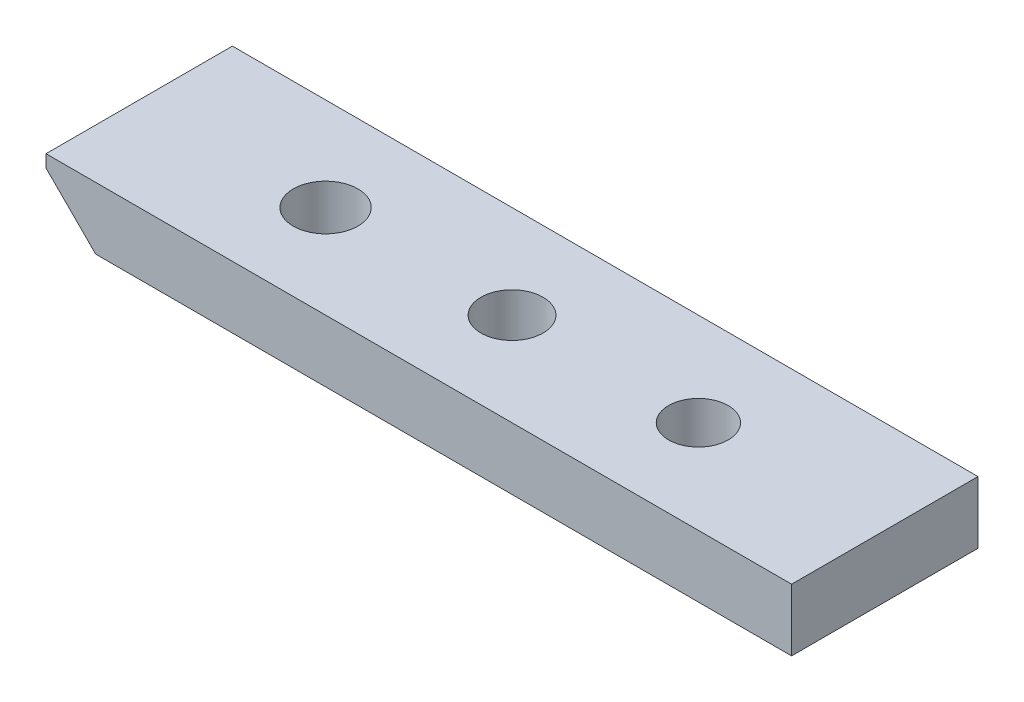
ISO-10303-21;
HEADER;
FILE_DESCRIPTION(('STEP AP214'),'2;1');
FILE_NAME('part.step','',(''),(''),'','','');
FILE_SCHEMA(('AUTOMOTIVE_DESIGN { 1 0 10303 214 1 1 1 1 }'));
ENDSEC;
DATA;
#1=APPLICATION_CONTEXT('core data for automotive mechanical design processes');
#2=APPLICATION_PROTOCOL_DEFINITION('international standard','automotive_design',2000,#1);
#3=PRODUCT_CONTEXT('',#1,'mechanical');
#4=PRODUCT('Part','Part','',(#3));
#5=PRODUCT_RELATED_PRODUCT_CATEGORY('part','',(#4));
#6=PRODUCT_DEFINITION_FORMATION('','',#4);
#7=PRODUCT_DEFINITION_CONTEXT('part definition',#1,'design');
#8=PRODUCT_DEFINITION('design','',#6,#7);
#9=PRODUCT_DEFINITION_SHAPE('','',#8);
#10=(LENGTH_UNIT() NAMED_UNIT(*) SI_UNIT(.MILLI.,.METRE.));
#11=(NAMED_UNIT(*) PLANE_ANGLE_UNIT() SI_UNIT($,.RADIAN.));
#12=(NAMED_UNIT(*) SI_UNIT($,.STERADIAN.) SOLID_ANGLE_UNIT());
#13=UNCERTAINTY_MEASURE_WITH_UNIT(LENGTH_MEASURE(1.E-05),#10,'distance_accuracy_value','');
#14=(GEOMETRIC_REPRESENTATION_CONTEXT(3) GLOBAL_UNCERTAINTY_ASSIGNED_CONTEXT((#13)) GLOBAL_UNIT_ASSIGNED_CONTEXT((#10,
#11,#12)) REPRESENTATION_CONTEXT('',''));
#15=CARTESIAN_POINT('',(0.,0.,0.));
#16=DIRECTION('',(0.,0.,1.));
#17=DIRECTION('',(1.,0.,0.));
#18=AXIS2_PLACEMENT_3D('',#15,#16,#17);
#19=CARTESIAN_POINT('',(-28.575,3.175,-4.7625));
#20=DIRECTION('',(1.,0.,0.));
#21=DIRECTION('',(0.,0.,-1.));
#22=AXIS2_PLACEMENT_3D('',#19,#20,#21);
#23=PLANE('',#22);
#24=DIRECTION('',(0.,-1.,0.));
#25=VECTOR('',#24,1.);
#26=CARTESIAN_POINT('',(-28.575,3.175,-4.7625));
#27=LINE('',#26,#25);
#28=CARTESIAN_POINT('',(-28.575,3.175,-4.7625));
#29=VERTEX_POINT('',#28);
#30=CARTESIAN_POINT('',(-28.575,2.54,-4.7625));
#31=VERTEX_POINT('',#30);
#32=EDGE_CURVE('E109',#29,#31,#27,.T.);
#33=ORIENTED_EDGE('',*,*,#32,.T.);
#34=DIRECTION('',(0.,0.,1.));
#35=VECTOR('',#34,1.);
#36=CARTESIAN_POINT('',(-28.575,2.54,-4.7625));
#37=LINE('',#36,#35);
#38=CARTESIAN_POINT('',(-28.575,2.54,4.7625));
#39=VERTEX_POINT('',#38);
#40=EDGE_CURVE('E100',#31,#39,#37,.T.);
#41=ORIENTED_EDGE('',*,*,#40,.T.);
#42=DIRECTION('',(0.,-1.,0.));
#43=VECTOR('',#42,1.);
#44=CARTESIAN_POINT('',(-28.575,3.175,4.7625));
#45=LINE('',#44,#43);
#46=CARTESIAN_POINT('',(-28.575,3.175,4.7625));
#47=VERTEX_POINT('',#46);
#48=EDGE_CURVE('E81',#47,#39,#45,.T.);
#49=ORIENTED_EDGE('',*,*,#48,.F.);
#50=DIRECTION('',(0.,0.,1.));
#51=VECTOR('',#50,1.);
#52=CARTESIAN_POINT('',(-28.575,3.175,-4.7625));
#53=LINE('',#52,#51);
#54=EDGE_CURVE('E87',#29,#47,#53,.T.);
#55=ORIENTED_EDGE('',*,*,#54,.F.);
#56=EDGE_LOOP('',(#33,#41,#49,#55));
#57=FACE_BOUND('',#56,.T.);
#58=ADVANCED_FACE('F33',(#57),#23,.F.);
#59=CARTESIAN_POINT('',(-28.575,3.175,4.7625));
#60=DIRECTION('',(0.,0.,-1.));
#61=DIRECTION('',(-1.,0.,0.));
#62=AXIS2_PLACEMENT_3D('',#59,#60,#61);
#63=PLANE('',#62);
#64=ORIENTED_EDGE('',*,*,#48,.T.);
#65=DIRECTION('',(-0.707106781186549,0.707106781186546,0.));
#66=VECTOR('',#65,1.);
#67=CARTESIAN_POINT('',(-28.575,2.54,4.7625));
#68=LINE('',#67,#66);
#69=CARTESIAN_POINT('',(-26.035,0.,4.7625));
#70=VERTEX_POINT('',#69);
#71=EDGE_CURVE('E55',#39,#70,#68,.F.);
#72=ORIENTED_EDGE('',*,*,#71,.T.);
#73=DIRECTION('',(1.,0.,0.));
#74=VECTOR('',#73,1.);
#75=CARTESIAN_POINT('',(-28.575,0.,4.7625));
#76=LINE('',#75,#74);
#77=CARTESIAN_POINT('',(9.525,0.,4.7625));
#78=VERTEX_POINT('',#77);
#79=EDGE_CURVE('E114',#70,#78,#76,.T.);
#80=ORIENTED_EDGE('',*,*,#79,.T.);
#81=DIRECTION('',(0.,-1.,0.));
#82=VECTOR('',#81,1.);
#83=CARTESIAN_POINT('',(9.525,3.175,4.7625));
#84=LINE('',#83,#82);
#85=CARTESIAN_POINT('',(9.525,3.175,4.7625));
#86=VERTEX_POINT('',#85);
#87=EDGE_CURVE('E83',#86,#78,#84,.T.);
#88=ORIENTED_EDGE('',*,*,#87,.F.);
#89=DIRECTION('',(1.,0.,0.));
#90=VECTOR('',#89,1.);
#91=CARTESIAN_POINT('',(-28.575,3.175,4.7625));
#92=LINE('',#91,#90);
#93=EDGE_CURVE('E77',#47,#86,#92,.T.);
#94=ORIENTED_EDGE('',*,*,#93,.F.);
#95=EDGE_LOOP('',(#64,#72,#80,#88,#94));
#96=FACE_BOUND('',#95,.T.);
#97=ADVANCED_FACE('F79',(#96),#63,.F.);
#98=CARTESIAN_POINT('',(9.525,3.175,-4.7625));
#99=DIRECTION('',(-1.,0.,0.));
#100=DIRECTION('',(0.,0.,1.));
#101=AXIS2_PLACEMENT_3D('',#98,#99,#100);
#102=PLANE('',#101);
#103=DIRECTION('',(0.,0.,-1.));
#104=VECTOR('',#103,1.);
#105=CARTESIAN_POINT('',(9.525,0.,-4.7625));
#106=LINE('',#105,#104);
#107=CARTESIAN_POINT('',(9.525,0.,-4.7625));
#108=VERTEX_POINT('',#107);
#109=EDGE_CURVE('E112',#78,#108,#106,.T.);
#110=ORIENTED_EDGE('',*,*,#109,.T.);
#111=DIRECTION('',(0.,-1.,0.));
#112=VECTOR('',#111,1.);
#113=CARTESIAN_POINT('',(9.525,3.175,-4.7625));
#114=LINE('',#113,#112);
#115=CARTESIAN_POINT('',(9.525,3.175,-4.7625));
#116=VERTEX_POINT('',#115);
#117=EDGE_CURVE('E103',#116,#108,#114,.T.);
#118=ORIENTED_EDGE('',*,*,#117,.F.);
#119=DIRECTION('',(0.,0.,-1.));
#120=VECTOR('',#119,1.);
#121=CARTESIAN_POINT('',(9.525,3.175,-4.7625));
#122=LINE('',#121,#120);
#123=EDGE_CURVE('E86',#86,#116,#122,.T.);
#124=ORIENTED_EDGE('',*,*,#123,.F.);
#125=ORIENTED_EDGE('',*,*,#87,.T.);
#126=EDGE_LOOP('',(#110,#118,#124,#125));
#127=FACE_BOUND('',#126,.T.);
#128=ADVANCED_FACE('F161',(#127),#102,.F.);
#129=CARTESIAN_POINT('',(-28.575,3.175,-4.7625));
#130=DIRECTION('',(0.,0.,1.));
#131=DIRECTION('',(1.,0.,0.));
#132=AXIS2_PLACEMENT_3D('',#129,#130,#131);
#133=PLANE('',#132);
#134=DIRECTION('',(-1.,0.,0.));
#135=VECTOR('',#134,1.);
#136=CARTESIAN_POINT('',(-28.575,0.,-4.7625));
#137=LINE('',#136,#135);
#138=CARTESIAN_POINT('',(-26.035,0.,-4.7625));
#139=VERTEX_POINT('',#138);
#140=EDGE_CURVE('E96',#108,#139,#137,.T.);
#141=ORIENTED_EDGE('',*,*,#140,.T.);
#142=DIRECTION('',(0.707106781186549,-0.707106781186546,0.));
#143=VECTOR('',#142,1.);
#144=CARTESIAN_POINT('',(-28.575,2.54,-4.7625));
#145=LINE('',#144,#143);
#146=EDGE_CURVE('E11',#139,#31,#145,.F.);
#147=ORIENTED_EDGE('',*,*,#146,.T.);
#148=ORIENTED_EDGE('',*,*,#32,.F.);
#149=DIRECTION('',(-1.,0.,0.));
#150=VECTOR('',#149,1.);
#151=CARTESIAN_POINT('',(-28.575,3.175,-4.7625));
#152=LINE('',#151,#150);
#153=EDGE_CURVE('E92',#116,#29,#152,.T.);
#154=ORIENTED_EDGE('',*,*,#153,.F.);
#155=ORIENTED_EDGE('',*,*,#117,.T.);
#156=EDGE_LOOP('',(#141,#147,#148,#154,#155));
#157=FACE_BOUND('',#156,.T.);
#158=ADVANCED_FACE('F158',(#157),#133,.F.);
#159=CARTESIAN_POINT('',(0.,3.175,0.));
#160=DIRECTION('',(0.,1.,0.));
#161=DIRECTION('',(0.,0.,1.));
#162=AXIS2_PLACEMENT_3D('',#159,#160,#161);
#163=PLANE('',#162);
#164=CARTESIAN_POINT('',(0.,3.175,0.));
#165=DIRECTION('',(0.,-1.,0.));
#166=DIRECTION('',(0.,0.,-1.));
#167=AXIS2_PLACEMENT_3D('',#164,#165,#166);
#168=CIRCLE('',#167,1.524);
#169=CARTESIAN_POINT('',(0.,3.175,-1.524));
#170=VERTEX_POINT('',#169);
#171=EDGE_CURVE('E128',#170,#170,#168,.T.);
#172=ORIENTED_EDGE('',*,*,#171,.T.);
#173=EDGE_LOOP('',(#172));
#174=FACE_BOUND('',#173,.T.);
#175=CARTESIAN_POINT('',(-9.525,3.175,0.));
#176=DIRECTION('',(0.,-1.,0.));
#177=DIRECTION('',(0.,0.,-1.));
#178=AXIS2_PLACEMENT_3D('',#175,#176,#177);
#179=CIRCLE('',#178,1.5875);
#180=CARTESIAN_POINT('',(-9.525,3.175,-1.5875));
#181=VERTEX_POINT('',#180);
#182=EDGE_CURVE('E122',#181,#181,#179,.T.);
#183=ORIENTED_EDGE('',*,*,#182,.T.);
#184=EDGE_LOOP('',(#183));
#185=FACE_BOUND('',#184,.T.);
#186=CARTESIAN_POINT('',(-19.05,3.175,0.));
#187=DIRECTION('',(0.,-1.,0.));
#188=DIRECTION('',(0.,0.,-1.));
#189=AXIS2_PLACEMENT_3D('',#186,#187,#188);
#190=CIRCLE('',#189,1.651);
#191=CARTESIAN_POINT('',(-19.05,3.175,-1.651));
#192=VERTEX_POINT('',#191);
#193=EDGE_CURVE('E116',#192,#192,#190,.T.);
#194=ORIENTED_EDGE('',*,*,#193,.T.);
#195=EDGE_LOOP('',(#194));
#196=FACE_BOUND('',#195,.T.);
#197=ORIENTED_EDGE('',*,*,#54,.T.);
#198=ORIENTED_EDGE('',*,*,#93,.T.);
#199=ORIENTED_EDGE('',*,*,#123,.T.);
#200=ORIENTED_EDGE('',*,*,#153,.T.);
#201=EDGE_LOOP('',(#197,#198,#199,#200));
#202=FACE_BOUND('',#201,.T.);
#203=ADVANCED_FACE('F90',(#174,#185,#196,#202),#163,.T.);
#204=CARTESIAN_POINT('',(0.,0.,0.));
#205=DIRECTION('',(0.,1.,0.));
#206=DIRECTION('',(0.,0.,1.));
#207=AXIS2_PLACEMENT_3D('',#204,#205,#206);
#208=PLANE('',#207);
#209=CARTESIAN_POINT('',(0.,0.,0.));
#210=DIRECTION('',(0.,-1.,0.));
#211=DIRECTION('',(0.,0.,-1.));
#212=AXIS2_PLACEMENT_3D('',#209,#210,#211);
#213=CIRCLE('',#212,1.524);
#214=CARTESIAN_POINT('',(0.,0.,-1.524));
#215=VERTEX_POINT('',#214);
#216=EDGE_CURVE('E131',#215,#215,#213,.T.);
#217=ORIENTED_EDGE('',*,*,#216,.F.);
#218=EDGE_LOOP('',(#217));
#219=FACE_BOUND('',#218,.T.);
#220=CARTESIAN_POINT('',(-9.525,0.,0.));
#221=DIRECTION('',(0.,-1.,0.));
#222=DIRECTION('',(0.,0.,-1.));
#223=AXIS2_PLACEMENT_3D('',#220,#221,#222);
#224=CIRCLE('',#223,1.5875);
#225=CARTESIAN_POINT('',(-9.525,0.,-1.5875));
#226=VERTEX_POINT('',#225);
#227=EDGE_CURVE('E125',#226,#226,#224,.T.);
#228=ORIENTED_EDGE('',*,*,#227,.F.);
#229=EDGE_LOOP('',(#228));
#230=FACE_BOUND('',#229,.T.);
#231=CARTESIAN_POINT('',(-19.05,0.,0.));
#232=DIRECTION('',(0.,-1.,0.));
#233=DIRECTION('',(0.,0.,-1.));
#234=AXIS2_PLACEMENT_3D('',#231,#232,#233);
#235=CIRCLE('',#234,1.651);
#236=CARTESIAN_POINT('',(-19.05,0.,-1.651));
#237=VERTEX_POINT('',#236);
#238=EDGE_CURVE('E119',#237,#237,#235,.T.);
#239=ORIENTED_EDGE('',*,*,#238,.F.);
#240=EDGE_LOOP('',(#239));
#241=FACE_BOUND('',#240,.T.);
#242=ORIENTED_EDGE('',*,*,#79,.F.);
#243=DIRECTION('',(0.,0.,-1.));
#244=VECTOR('',#243,1.);
#245=CARTESIAN_POINT('',(-26.035,0.,0.));
#246=LINE('',#245,#244);
#247=EDGE_CURVE('E41',#70,#139,#246,.T.);
#248=ORIENTED_EDGE('',*,*,#247,.T.);
#249=ORIENTED_EDGE('',*,*,#140,.F.);
#250=ORIENTED_EDGE('',*,*,#109,.F.);
#251=EDGE_LOOP('',(#242,#248,#249,#250));
#252=FACE_BOUND('',#251,.T.);
#253=ADVANCED_FACE('F146',(#219,#230,#241,#252),#208,.F.);
#254=CARTESIAN_POINT('',(-19.05,3.175,0.));
#255=DIRECTION('',(0.,-1.,0.));
#256=DIRECTION('',(0.,0.,-1.));
#257=AXIS2_PLACEMENT_3D('',#254,#255,#256);
#258=CYLINDRICAL_SURFACE('',#257,1.651);
#259=ORIENTED_EDGE('',*,*,#193,.F.);
#260=EDGE_LOOP('',(#259));
#261=FACE_BOUND('',#260,.T.);
#262=ORIENTED_EDGE('',*,*,#238,.T.);
#263=EDGE_LOOP('',(#262));
#264=FACE_BOUND('',#263,.T.);
#265=ADVANCED_FACE('F149',(#261,#264),#258,.F.);
#266=CARTESIAN_POINT('',(-9.525,3.175,0.));
#267=DIRECTION('',(0.,-1.,0.));
#268=DIRECTION('',(0.,0.,-1.));
#269=AXIS2_PLACEMENT_3D('',#266,#267,#268);
#270=CYLINDRICAL_SURFACE('',#269,1.5875);
#271=ORIENTED_EDGE('',*,*,#182,.F.);
#272=EDGE_LOOP('',(#271));
#273=FACE_BOUND('',#272,.T.);
#274=ORIENTED_EDGE('',*,*,#227,.T.);
#275=EDGE_LOOP('',(#274));
#276=FACE_BOUND('',#275,.T.);
#277=ADVANCED_FACE('F142',(#273,#276),#270,.F.);
#278=CARTESIAN_POINT('',(0.,3.175,0.));
#279=DIRECTION('',(0.,-1.,0.));
#280=DIRECTION('',(0.,0.,-1.));
#281=AXIS2_PLACEMENT_3D('',#278,#279,#280);
#282=CYLINDRICAL_SURFACE('',#281,1.524);
#283=ORIENTED_EDGE('',*,*,#171,.F.);
#284=EDGE_LOOP('',(#283));
#285=FACE_BOUND('',#284,.T.);
#286=ORIENTED_EDGE('',*,*,#216,.T.);
#287=EDGE_LOOP('',(#286));
#288=FACE_BOUND('',#287,.T.);
#289=ADVANCED_FACE('F139',(#285,#288),#282,.F.);
#290=CARTESIAN_POINT('',(-28.575,2.54,-4.7625));
#291=DIRECTION('',(0.707106781186546,0.707106781186549,0.));
#292=DIRECTION('',(0.,0.,1.));
#293=AXIS2_PLACEMENT_3D('',#290,#291,#292);
#294=PLANE('',#293);
#295=ORIENTED_EDGE('',*,*,#146,.F.);
#296=ORIENTED_EDGE('',*,*,#247,.F.);
#297=ORIENTED_EDGE('',*,*,#71,.F.);
#298=ORIENTED_EDGE('',*,*,#40,.F.);
#299=EDGE_LOOP('',(#295,#296,#297,#298));
#300=FACE_BOUND('',#299,.T.);
#301=ADVANCED_FACE('F35',(#300),#294,.F.);
#302=CLOSED_SHELL('',(#58,#97,#128,#158,#203,#253,#265,#277,#289,#301));
#303=MANIFOLD_SOLID_BREP('B2',#302);
#304=ADVANCED_BREP_SHAPE_REPRESENTATION('',(#18,#303),#14);
#305=SHAPE_DEFINITION_REPRESENTATION(#9,#304);
ENDSEC;
END-ISO-10303-21;
